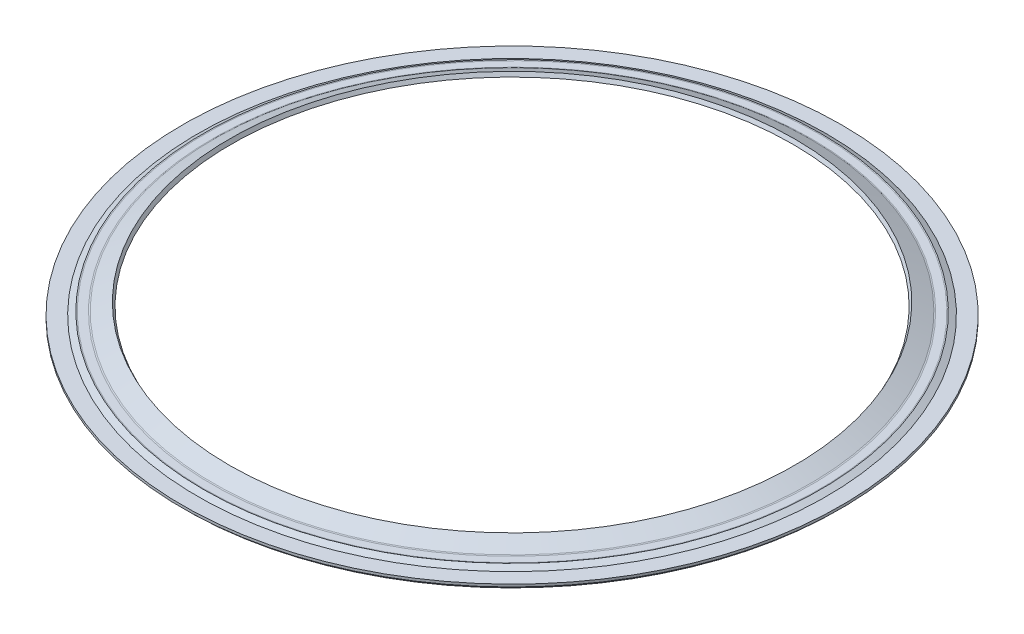
ISO-10303-21;
HEADER;
FILE_DESCRIPTION(('STEP AP214'),'2;1');
FILE_NAME('part.step','',(''),(''),'','','');
FILE_SCHEMA(('AUTOMOTIVE_DESIGN { 1 0 10303 214 1 1 1 1 }'));
ENDSEC;
DATA;
#1=APPLICATION_CONTEXT('core data for automotive mechanical design processes');
#2=APPLICATION_PROTOCOL_DEFINITION('international standard','automotive_design',2000,#1);
#3=PRODUCT_CONTEXT('',#1,'mechanical');
#4=PRODUCT('Part','Part','',(#3));
#5=PRODUCT_RELATED_PRODUCT_CATEGORY('part','',(#4));
#6=PRODUCT_DEFINITION_FORMATION('','',#4);
#7=PRODUCT_DEFINITION_CONTEXT('part definition',#1,'design');
#8=PRODUCT_DEFINITION('design','',#6,#7);
#9=PRODUCT_DEFINITION_SHAPE('','',#8);
#10=(LENGTH_UNIT() NAMED_UNIT(*) SI_UNIT(.MILLI.,.METRE.));
#11=(NAMED_UNIT(*) PLANE_ANGLE_UNIT() SI_UNIT($,.RADIAN.));
#12=(NAMED_UNIT(*) SI_UNIT($,.STERADIAN.) SOLID_ANGLE_UNIT());
#13=UNCERTAINTY_MEASURE_WITH_UNIT(LENGTH_MEASURE(1.E-05),#10,'distance_accuracy_value','');
#14=(GEOMETRIC_REPRESENTATION_CONTEXT(3) GLOBAL_UNCERTAINTY_ASSIGNED_CONTEXT((#13)) GLOBAL_UNIT_ASSIGNED_CONTEXT((#10,
#11,#12)) REPRESENTATION_CONTEXT('',''));
#15=CARTESIAN_POINT('',(0.,0.,0.));
#16=DIRECTION('',(0.,0.,1.));
#17=DIRECTION('',(1.,0.,0.));
#18=AXIS2_PLACEMENT_3D('',#15,#16,#17);
#19=CARTESIAN_POINT('',(0.,-14.6628214965691,0.));
#20=DIRECTION('',(0.,-1.,0.));
#21=DIRECTION('',(0.,0.,-1.));
#22=AXIS2_PLACEMENT_3D('',#19,#20,#21);
#23=CONICAL_SURFACE('',#22,98.1106605553937,1.07459089101126);
#24=CARTESIAN_POINT('',(0.,-21.977991693932,0.));
#25=DIRECTION('',(0.,1.,0.));
#26=DIRECTION('',(0.,0.,1.));
#27=AXIS2_PLACEMENT_3D('',#24,#25,#26);
#28=CIRCLE('',#27,111.622600880292);
#29=CARTESIAN_POINT('',(0.,-21.977991693932,111.622600880292));
#30=VERTEX_POINT('',#29);
#31=EDGE_CURVE('E68',#30,#30,#28,.T.);
#32=ORIENTED_EDGE('',*,*,#31,.F.);
#33=EDGE_LOOP('',(#32));
#34=FACE_BOUND('',#33,.T.);
#35=CARTESIAN_POINT('',(0.,-23.1070358499394,0.));
#36=DIRECTION('',(0.,-1.,0.));
#37=DIRECTION('',(0.,0.,-1.));
#38=AXIS2_PLACEMENT_3D('',#35,#36,#37);
#39=CIRCLE('',#38,113.708072147338);
#40=CARTESIAN_POINT('',(0.,-23.1070358499394,-113.708072147338));
#41=VERTEX_POINT('',#40);
#42=EDGE_CURVE('E64',#41,#41,#39,.T.);
#43=ORIENTED_EDGE('',*,*,#42,.F.);
#44=EDGE_LOOP('',(#43));
#45=FACE_BOUND('',#44,.T.);
#46=ADVANCED_FACE('F15',(#34,#45),#23,.T.);
#47=CARTESIAN_POINT('',(0.,-21.05,0.));
#48=DIRECTION('',(0.,-1.,0.));
#49=DIRECTION('',(0.,0.,-1.));
#50=AXIS2_PLACEMENT_3D('',#47,#48,#49);
#51=TOROIDAL_SURFACE('',#50,111.25,1.);
#52=ORIENTED_EDGE('',*,*,#31,.T.);
#53=EDGE_LOOP('',(#52));
#54=FACE_BOUND('',#53,.T.);
#55=CARTESIAN_POINT('',(0.,-22.05,0.));
#56=DIRECTION('',(0.,-1.,0.));
#57=DIRECTION('',(0.,0.,-1.));
#58=AXIS2_PLACEMENT_3D('',#55,#56,#57);
#59=CIRCLE('',#58,111.25);
#60=CARTESIAN_POINT('',(0.,-22.05,-111.25));
#61=VERTEX_POINT('',#60);
#62=EDGE_CURVE('E60',#61,#61,#59,.T.);
#63=ORIENTED_EDGE('',*,*,#62,.T.);
#64=EDGE_LOOP('',(#63));
#65=FACE_BOUND('',#64,.T.);
#66=ADVANCED_FACE('F75',(#54,#65),#51,.F.);
#67=CARTESIAN_POINT('',(113.708072147338,-23.1070358499394,0.));
#68=DIRECTION('',(0.,-1.,0.));
#69=DIRECTION('',(0.,0.,-1.));
#70=AXIS2_PLACEMENT_3D('',#67,#68,#69);
#71=PLANE('',#70);
#72=ORIENTED_EDGE('',*,*,#42,.T.);
#73=EDGE_LOOP('',(#72));
#74=FACE_BOUND('',#73,.T.);
#75=CARTESIAN_POINT('',(0.,-23.1070358499394,0.));
#76=DIRECTION('',(0.,-1.,0.));
#77=DIRECTION('',(0.,0.,-1.));
#78=AXIS2_PLACEMENT_3D('',#75,#76,#77);
#79=CIRCLE('',#78,119.25);
#80=CARTESIAN_POINT('',(0.,-23.1070358499394,-119.25));
#81=VERTEX_POINT('',#80);
#82=EDGE_CURVE('E56',#81,#81,#79,.T.);
#83=ORIENTED_EDGE('',*,*,#82,.F.);
#84=EDGE_LOOP('',(#83));
#85=FACE_BOUND('',#84,.T.);
#86=ADVANCED_FACE('F83',(#74,#85),#71,.F.);
#87=CARTESIAN_POINT('',(-111.25,-22.05,0.));
#88=DIRECTION('',(0.,-1.,0.));
#89=DIRECTION('',(0.,0.,-1.));
#90=AXIS2_PLACEMENT_3D('',#87,#88,#89);
#91=PLANE('',#90);
#92=ORIENTED_EDGE('',*,*,#62,.F.);
#93=EDGE_LOOP('',(#92));
#94=FACE_BOUND('',#93,.T.);
#95=CARTESIAN_POINT('',(0.,-22.05,0.));
#96=DIRECTION('',(0.,-1.,0.));
#97=DIRECTION('',(0.,0.,-1.));
#98=AXIS2_PLACEMENT_3D('',#95,#96,#97);
#99=CIRCLE('',#98,108.386450110092);
#100=CARTESIAN_POINT('',(0.,-22.05,-108.386450110092));
#101=VERTEX_POINT('',#100);
#102=EDGE_CURVE('E52',#101,#101,#99,.T.);
#103=ORIENTED_EDGE('',*,*,#102,.T.);
#104=EDGE_LOOP('',(#103));
#105=FACE_BOUND('',#104,.T.);
#106=ADVANCED_FACE('F86',(#94,#105),#91,.F.);
#107=CARTESIAN_POINT('',(0.,-27.7871737307479,0.));
#108=DIRECTION('',(0.,-1.,0.));
#109=DIRECTION('',(0.,0.,-1.));
#110=AXIS2_PLACEMENT_3D('',#107,#108,#109);
#111=CYLINDRICAL_SURFACE('',#110,119.25);
#112=ORIENTED_EDGE('',*,*,#82,.T.);
#113=EDGE_LOOP('',(#112));
#114=FACE_BOUND('',#113,.T.);
#115=CARTESIAN_POINT('',(0.,-24.,0.));
#116=DIRECTION('',(0.,-1.,0.));
#117=DIRECTION('',(0.,0.,-1.));
#118=AXIS2_PLACEMENT_3D('',#115,#116,#117);
#119=CIRCLE('',#118,119.25);
#120=CARTESIAN_POINT('',(0.,-24.,-119.25));
#121=VERTEX_POINT('',#120);
#122=EDGE_CURVE('E48',#121,#121,#119,.T.);
#123=ORIENTED_EDGE('',*,*,#122,.F.);
#124=EDGE_LOOP('',(#123));
#125=FACE_BOUND('',#124,.T.);
#126=ADVANCED_FACE('F90',(#114,#125),#111,.T.);
#127=CARTESIAN_POINT('',(0.,-21.05,0.));
#128=DIRECTION('',(0.,-1.,0.));
#129=DIRECTION('',(0.,0.,-1.));
#130=AXIS2_PLACEMENT_3D('',#127,#128,#129);
#131=TOROIDAL_SURFACE('',#130,108.386450110092,1.);
#132=ORIENTED_EDGE('',*,*,#102,.F.);
#133=EDGE_LOOP('',(#132));
#134=FACE_BOUND('',#133,.T.);
#135=CARTESIAN_POINT('',(0.,-21.9404815186077,0.));
#136=DIRECTION('',(0.,-1.,0.));
#137=DIRECTION('',(0.,0.,-1.));
#138=AXIS2_PLACEMENT_3D('',#135,#136,#137);
#139=CIRCLE('',#138,107.931430698399);
#140=CARTESIAN_POINT('',(0.,-21.9404815186077,-107.931430698399));
#141=VERTEX_POINT('',#140);
#142=EDGE_CURVE('E44',#141,#141,#139,.T.);
#143=ORIENTED_EDGE('',*,*,#142,.T.);
#144=EDGE_LOOP('',(#143));
#145=FACE_BOUND('',#144,.T.);
#146=ADVANCED_FACE('F93',(#134,#145),#131,.F.);
#147=CARTESIAN_POINT('',(0.,-24.,0.));
#148=DIRECTION('',(0.,1.,0.));
#149=DIRECTION('',(0.,0.,1.));
#150=AXIS2_PLACEMENT_3D('',#147,#148,#149);
#151=CONICAL_SURFACE('',#150,119.25,0.785398163397453);
#152=CARTESIAN_POINT('',(0.,-25.,0.));
#153=DIRECTION('',(0.,-1.,0.));
#154=DIRECTION('',(0.,0.,-1.));
#155=AXIS2_PLACEMENT_3D('',#152,#153,#154);
#156=CIRCLE('',#155,118.25);
#157=CARTESIAN_POINT('',(0.,-25.,-118.25));
#158=VERTEX_POINT('',#157);
#159=EDGE_CURVE('E38',#158,#158,#156,.T.);
#160=ORIENTED_EDGE('',*,*,#159,.F.);
#161=EDGE_LOOP('',(#160));
#162=FACE_BOUND('',#161,.T.);
#163=ORIENTED_EDGE('',*,*,#122,.T.);
#164=EDGE_LOOP('',(#163));
#165=FACE_BOUND('',#164,.T.);
#166=ADVANCED_FACE('F97',(#162,#165),#151,.T.);
#167=CARTESIAN_POINT('',(0.,-19.05,0.));
#168=DIRECTION('',(0.,-1.,0.));
#169=DIRECTION('',(0.,0.,-1.));
#170=AXIS2_PLACEMENT_3D('',#167,#168,#169);
#171=CONICAL_SURFACE('',#170,102.274704180696,1.09840231368963);
#172=CARTESIAN_POINT('',(0.,-19.05,0.));
#173=DIRECTION('',(0.,-1.,0.));
#174=DIRECTION('',(0.,0.,-1.));
#175=AXIS2_PLACEMENT_3D('',#172,#173,#174);
#176=CIRCLE('',#175,102.274704180696);
#177=CARTESIAN_POINT('',(0.,-19.05,-102.274704180696));
#178=VERTEX_POINT('',#177);
#179=EDGE_CURVE('E31',#178,#178,#176,.T.);
#180=ORIENTED_EDGE('',*,*,#179,.T.);
#181=EDGE_LOOP('',(#180));
#182=FACE_BOUND('',#181,.T.);
#183=ORIENTED_EDGE('',*,*,#142,.F.);
#184=EDGE_LOOP('',(#183));
#185=FACE_BOUND('',#184,.T.);
#186=ADVANCED_FACE('F99',(#182,#185),#171,.T.);
#187=CARTESIAN_POINT('',(-118.25,-25.,0.));
#188=DIRECTION('',(0.,1.,0.));
#189=DIRECTION('',(0.,0.,1.));
#190=AXIS2_PLACEMENT_3D('',#187,#188,#189);
#191=PLANE('',#190);
#192=CARTESIAN_POINT('',(0.,-25.,0.));
#193=DIRECTION('',(0.,-1.,0.));
#194=DIRECTION('',(0.,0.,-1.));
#195=AXIS2_PLACEMENT_3D('',#192,#193,#194);
#196=CIRCLE('',#195,110.668379089604);
#197=CARTESIAN_POINT('',(0.,-25.,-110.668379089604));
#198=VERTEX_POINT('',#197);
#199=EDGE_CURVE('E23',#198,#198,#196,.T.);
#200=ORIENTED_EDGE('',*,*,#199,.F.);
#201=EDGE_LOOP('',(#200));
#202=FACE_BOUND('',#201,.T.);
#203=ORIENTED_EDGE('',*,*,#159,.T.);
#204=EDGE_LOOP('',(#203));
#205=FACE_BOUND('',#204,.T.);
#206=ADVANCED_FACE('F107',(#202,#205),#191,.F.);
#207=CARTESIAN_POINT('',(0.,-20.3670934194278,0.));
#208=DIRECTION('',(0.,1.,0.));
#209=DIRECTION('',(0.,0.,1.));
#210=AXIS2_PLACEMENT_3D('',#207,#208,#209);
#211=CONICAL_SURFACE('',#210,101.601694061642,0.472394013105292);
#212=CARTESIAN_POINT('',(0.,-20.3670934194278,0.));
#213=DIRECTION('',(0.,-1.,0.));
#214=DIRECTION('',(0.,0.,-1.));
#215=AXIS2_PLACEMENT_3D('',#212,#213,#214);
#216=CIRCLE('',#215,101.601694061642);
#217=CARTESIAN_POINT('',(0.,-20.3670934194278,-101.601694061642));
#218=VERTEX_POINT('',#217);
#219=EDGE_CURVE('E10',#218,#218,#216,.T.);
#220=ORIENTED_EDGE('',*,*,#219,.T.);
#221=EDGE_LOOP('',(#220));
#222=FACE_BOUND('',#221,.T.);
#223=ORIENTED_EDGE('',*,*,#179,.F.);
#224=EDGE_LOOP('',(#223));
#225=FACE_BOUND('',#224,.T.);
#226=ADVANCED_FACE('F115',(#222,#225),#211,.F.);
#227=CARTESIAN_POINT('',(0.,-25.,0.));
#228=DIRECTION('',(0.,-1.,0.));
#229=DIRECTION('',(0.,0.,-1.));
#230=AXIS2_PLACEMENT_3D('',#227,#228,#229);
#231=CONICAL_SURFACE('',#230,110.668379089604,1.09840231368963);
#232=ORIENTED_EDGE('',*,*,#219,.F.);
#233=EDGE_LOOP('',(#232));
#234=FACE_BOUND('',#233,.T.);
#235=ORIENTED_EDGE('',*,*,#199,.T.);
#236=EDGE_LOOP('',(#235));
#237=FACE_BOUND('',#236,.T.);
#238=ADVANCED_FACE('F17',(#234,#237),#231,.F.);
#239=CLOSED_SHELL('',(#46,#66,#86,#106,#126,#146,#166,#186,#206,#226,#238));
#240=MANIFOLD_SOLID_BREP('B1',#239);
#241=ADVANCED_BREP_SHAPE_REPRESENTATION('',(#18,#240),#14);
#242=SHAPE_DEFINITION_REPRESENTATION(#9,#241);
ENDSEC;
END-ISO-10303-21;
